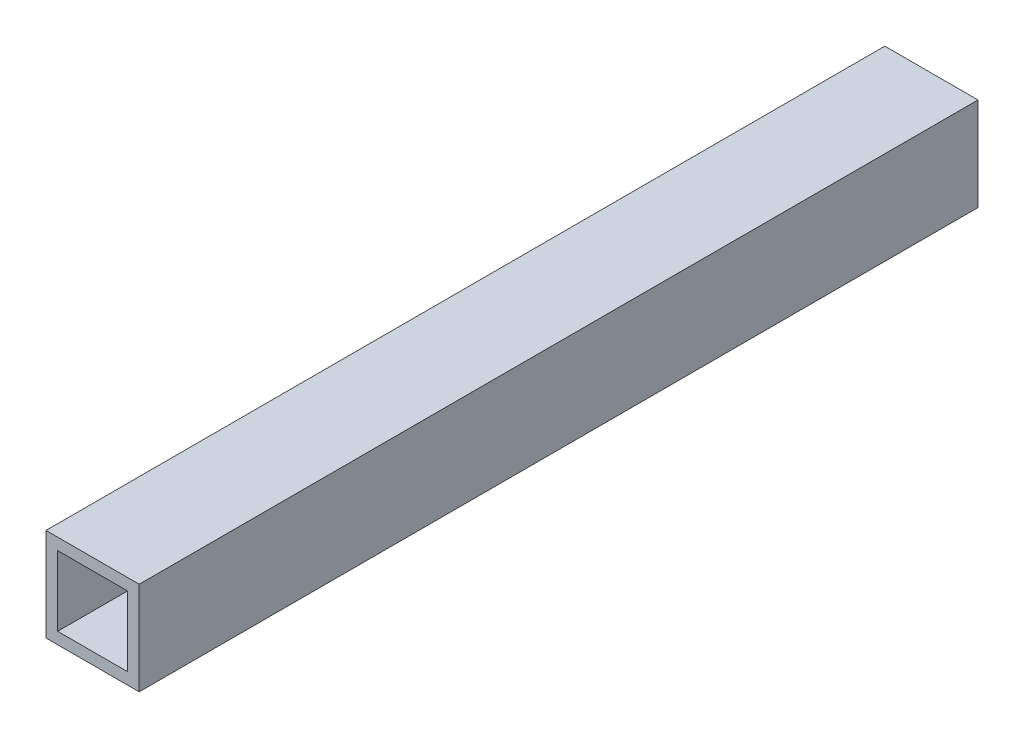
ISO-10303-21;
HEADER;
FILE_DESCRIPTION(('STEP AP214'),'2;1');
FILE_NAME('part.step','',(''),(''),'','','');
FILE_SCHEMA(('AUTOMOTIVE_DESIGN { 1 0 10303 214 1 1 1 1 }'));
ENDSEC;
DATA;
#1=APPLICATION_CONTEXT('core data for automotive mechanical design processes');
#2=APPLICATION_PROTOCOL_DEFINITION('international standard','automotive_design',2000,#1);
#3=PRODUCT_CONTEXT('',#1,'mechanical');
#4=PRODUCT('Part','Part','',(#3));
#5=PRODUCT_RELATED_PRODUCT_CATEGORY('part','',(#4));
#6=PRODUCT_DEFINITION_FORMATION('','',#4);
#7=PRODUCT_DEFINITION_CONTEXT('part definition',#1,'design');
#8=PRODUCT_DEFINITION('design','',#6,#7);
#9=PRODUCT_DEFINITION_SHAPE('','',#8);
#10=(LENGTH_UNIT() NAMED_UNIT(*) SI_UNIT(.MILLI.,.METRE.));
#11=(NAMED_UNIT(*) PLANE_ANGLE_UNIT() SI_UNIT($,.RADIAN.));
#12=(NAMED_UNIT(*) SI_UNIT($,.STERADIAN.) SOLID_ANGLE_UNIT());
#13=UNCERTAINTY_MEASURE_WITH_UNIT(LENGTH_MEASURE(1.E-05),#10,'distance_accuracy_value','');
#14=(GEOMETRIC_REPRESENTATION_CONTEXT(3) GLOBAL_UNCERTAINTY_ASSIGNED_CONTEXT((#13)) GLOBAL_UNIT_ASSIGNED_CONTEXT((#10,
#11,#12)) REPRESENTATION_CONTEXT('',''));
#15=CARTESIAN_POINT('',(0.,0.,0.));
#16=DIRECTION('',(0.,0.,1.));
#17=DIRECTION('',(1.,0.,0.));
#18=AXIS2_PLACEMENT_3D('',#15,#16,#17);
#19=CARTESIAN_POINT('',(0.,0.,114.3));
#20=DIRECTION('',(0.,0.,1.));
#21=DIRECTION('',(1.,0.,0.));
#22=AXIS2_PLACEMENT_3D('',#19,#20,#21);
#23=PLANE('',#22);
#24=DIRECTION('',(0.,-1.,0.));
#25=VECTOR('',#24,1.);
#26=CARTESIAN_POINT('',(-12.7,-12.7,114.3));
#27=LINE('',#26,#25);
#28=CARTESIAN_POINT('',(-12.7,12.7,114.3));
#29=VERTEX_POINT('',#28);
#30=CARTESIAN_POINT('',(-12.7,-12.7,114.3));
#31=VERTEX_POINT('',#30);
#32=EDGE_CURVE('E117',#29,#31,#27,.T.);
#33=ORIENTED_EDGE('',*,*,#32,.T.);
#34=DIRECTION('',(1.,0.,0.));
#35=VECTOR('',#34,1.);
#36=CARTESIAN_POINT('',(12.7,-12.7,114.3));
#37=LINE('',#36,#35);
#38=CARTESIAN_POINT('',(12.7,-12.7,114.3));
#39=VERTEX_POINT('',#38);
#40=EDGE_CURVE('E176',#31,#39,#37,.T.);
#41=ORIENTED_EDGE('',*,*,#40,.T.);
#42=DIRECTION('',(0.,1.,0.));
#43=VECTOR('',#42,1.);
#44=CARTESIAN_POINT('',(12.7,-12.7,114.3));
#45=LINE('',#44,#43);
#46=CARTESIAN_POINT('',(12.7,12.7,114.3));
#47=VERTEX_POINT('',#46);
#48=EDGE_CURVE('E179',#39,#47,#45,.T.);
#49=ORIENTED_EDGE('',*,*,#48,.T.);
#50=DIRECTION('',(-1.,0.,0.));
#51=VECTOR('',#50,1.);
#52=CARTESIAN_POINT('',(12.7,12.7,114.3));
#53=LINE('',#52,#51);
#54=EDGE_CURVE('E63',#47,#29,#53,.T.);
#55=ORIENTED_EDGE('',*,*,#54,.T.);
#56=EDGE_LOOP('',(#33,#41,#49,#55));
#57=FACE_BOUND('',#56,.T.);
#58=DIRECTION('',(1.,0.,0.));
#59=VECTOR('',#58,1.);
#60=CARTESIAN_POINT('',(9.525,-9.525,114.3));
#61=LINE('',#60,#59);
#62=CARTESIAN_POINT('',(-9.52499999999999,-9.525,114.3));
#63=VERTEX_POINT('',#62);
#64=CARTESIAN_POINT('',(9.525,-9.525,114.3));
#65=VERTEX_POINT('',#64);
#66=EDGE_CURVE('E158',#63,#65,#61,.T.);
#67=ORIENTED_EDGE('',*,*,#66,.F.);
#68=DIRECTION('',(0.,-1.,0.));
#69=VECTOR('',#68,1.);
#70=CARTESIAN_POINT('',(-9.52499999999999,-9.525,114.3));
#71=LINE('',#70,#69);
#72=CARTESIAN_POINT('',(-9.52499999999999,9.525,114.3));
#73=VERTEX_POINT('',#72);
#74=EDGE_CURVE('E113',#73,#63,#71,.T.);
#75=ORIENTED_EDGE('',*,*,#74,.F.);
#76=DIRECTION('',(-1.,0.,0.));
#77=VECTOR('',#76,1.);
#78=CARTESIAN_POINT('',(9.525,9.525,114.3));
#79=LINE('',#78,#77);
#80=CARTESIAN_POINT('',(9.525,9.525,114.3));
#81=VERTEX_POINT('',#80);
#82=EDGE_CURVE('E164',#81,#73,#79,.T.);
#83=ORIENTED_EDGE('',*,*,#82,.F.);
#84=DIRECTION('',(0.,1.,0.));
#85=VECTOR('',#84,1.);
#86=CARTESIAN_POINT('',(9.525,-9.525,114.3));
#87=LINE('',#86,#85);
#88=EDGE_CURVE('E161',#65,#81,#87,.T.);
#89=ORIENTED_EDGE('',*,*,#88,.F.);
#90=EDGE_LOOP('',(#67,#75,#83,#89));
#91=FACE_BOUND('',#90,.T.);
#92=ADVANCED_FACE('F39',(#57,#91),#23,.T.);
#93=CARTESIAN_POINT('',(-12.7,-12.7,114.3));
#94=DIRECTION('',(1.,0.,0.));
#95=DIRECTION('',(0.,0.,-1.));
#96=AXIS2_PLACEMENT_3D('',#93,#94,#95);
#97=PLANE('',#96);
#98=DIRECTION('',(0.,0.,-1.));
#99=VECTOR('',#98,1.);
#100=CARTESIAN_POINT('',(-12.7,12.7,114.3));
#101=LINE('',#100,#99);
#102=CARTESIAN_POINT('',(-12.7,12.7,-114.3));
#103=VERTEX_POINT('',#102);
#104=EDGE_CURVE('E184',#29,#103,#101,.T.);
#105=ORIENTED_EDGE('',*,*,#104,.T.);
#106=DIRECTION('',(0.,-1.,0.));
#107=VECTOR('',#106,1.);
#108=CARTESIAN_POINT('',(-12.7,-12.7,-114.3));
#109=LINE('',#108,#107);
#110=CARTESIAN_POINT('',(-12.7,-12.7,-114.3));
#111=VERTEX_POINT('',#110);
#112=EDGE_CURVE('E140',#103,#111,#109,.T.);
#113=ORIENTED_EDGE('',*,*,#112,.T.);
#114=DIRECTION('',(0.,0.,-1.));
#115=VECTOR('',#114,1.);
#116=CARTESIAN_POINT('',(-12.7,-12.7,114.3));
#117=LINE('',#116,#115);
#118=EDGE_CURVE('E11',#31,#111,#117,.T.);
#119=ORIENTED_EDGE('',*,*,#118,.F.);
#120=ORIENTED_EDGE('',*,*,#32,.F.);
#121=EDGE_LOOP('',(#105,#113,#119,#120));
#122=FACE_BOUND('',#121,.T.);
#123=ADVANCED_FACE('F41',(#122),#97,.F.);
#124=CARTESIAN_POINT('',(12.7,-12.7,114.3));
#125=DIRECTION('',(0.,1.,0.));
#126=DIRECTION('',(0.,0.,1.));
#127=AXIS2_PLACEMENT_3D('',#124,#125,#126);
#128=PLANE('',#127);
#129=ORIENTED_EDGE('',*,*,#118,.T.);
#130=DIRECTION('',(1.,0.,0.));
#131=VECTOR('',#130,1.);
#132=CARTESIAN_POINT('',(12.7,-12.7,-114.3));
#133=LINE('',#132,#131);
#134=CARTESIAN_POINT('',(12.7,-12.7,-114.3));
#135=VERTEX_POINT('',#134);
#136=EDGE_CURVE('E144',#111,#135,#133,.T.);
#137=ORIENTED_EDGE('',*,*,#136,.T.);
#138=DIRECTION('',(0.,0.,-1.));
#139=VECTOR('',#138,1.);
#140=CARTESIAN_POINT('',(12.7,-12.7,114.3));
#141=LINE('',#140,#139);
#142=EDGE_CURVE('E48',#39,#135,#141,.T.);
#143=ORIENTED_EDGE('',*,*,#142,.F.);
#144=ORIENTED_EDGE('',*,*,#40,.F.);
#145=EDGE_LOOP('',(#129,#137,#143,#144));
#146=FACE_BOUND('',#145,.T.);
#147=ADVANCED_FACE('F200',(#146),#128,.F.);
#148=CARTESIAN_POINT('',(12.7,-12.7,114.3));
#149=DIRECTION('',(-1.,0.,0.));
#150=DIRECTION('',(0.,0.,1.));
#151=AXIS2_PLACEMENT_3D('',#148,#149,#150);
#152=PLANE('',#151);
#153=ORIENTED_EDGE('',*,*,#142,.T.);
#154=DIRECTION('',(0.,1.,0.));
#155=VECTOR('',#154,1.);
#156=CARTESIAN_POINT('',(12.7,-12.7,-114.3));
#157=LINE('',#156,#155);
#158=CARTESIAN_POINT('',(12.7,12.7,-114.3));
#159=VERTEX_POINT('',#158);
#160=EDGE_CURVE('E148',#135,#159,#157,.T.);
#161=ORIENTED_EDGE('',*,*,#160,.T.);
#162=DIRECTION('',(0.,0.,-1.));
#163=VECTOR('',#162,1.);
#164=CARTESIAN_POINT('',(12.7,12.7,114.3));
#165=LINE('',#164,#163);
#166=EDGE_CURVE('E187',#47,#159,#165,.T.);
#167=ORIENTED_EDGE('',*,*,#166,.F.);
#168=ORIENTED_EDGE('',*,*,#48,.F.);
#169=EDGE_LOOP('',(#153,#161,#167,#168));
#170=FACE_BOUND('',#169,.T.);
#171=ADVANCED_FACE('F194',(#170),#152,.F.);
#172=CARTESIAN_POINT('',(12.7,12.7,114.3));
#173=DIRECTION('',(0.,-1.,0.));
#174=DIRECTION('',(0.,0.,-1.));
#175=AXIS2_PLACEMENT_3D('',#172,#173,#174);
#176=PLANE('',#175);
#177=ORIENTED_EDGE('',*,*,#166,.T.);
#178=DIRECTION('',(-1.,0.,0.));
#179=VECTOR('',#178,1.);
#180=CARTESIAN_POINT('',(12.7,12.7,-114.3));
#181=LINE('',#180,#179);
#182=EDGE_CURVE('E152',#159,#103,#181,.T.);
#183=ORIENTED_EDGE('',*,*,#182,.T.);
#184=ORIENTED_EDGE('',*,*,#104,.F.);
#185=ORIENTED_EDGE('',*,*,#54,.F.);
#186=EDGE_LOOP('',(#177,#183,#184,#185));
#187=FACE_BOUND('',#186,.T.);
#188=ADVANCED_FACE('F205',(#187),#176,.F.);
#189=CARTESIAN_POINT('',(-9.52499999999999,-9.525,114.3));
#190=DIRECTION('',(1.,0.,0.));
#191=DIRECTION('',(0.,0.,-1.));
#192=AXIS2_PLACEMENT_3D('',#189,#190,#191);
#193=PLANE('',#192);
#194=DIRECTION('',(0.,0.,-1.));
#195=VECTOR('',#194,1.);
#196=CARTESIAN_POINT('',(-9.52499999999999,-9.525,114.3));
#197=LINE('',#196,#195);
#198=CARTESIAN_POINT('',(-9.52499999999999,-9.525,-114.3));
#199=VERTEX_POINT('',#198);
#200=EDGE_CURVE('E105',#63,#199,#197,.T.);
#201=ORIENTED_EDGE('',*,*,#200,.T.);
#202=DIRECTION('',(0.,-1.,0.));
#203=VECTOR('',#202,1.);
#204=CARTESIAN_POINT('',(-9.52499999999999,-9.525,-114.3));
#205=LINE('',#204,#203);
#206=CARTESIAN_POINT('',(-9.52499999999999,9.525,-114.3));
#207=VERTEX_POINT('',#206);
#208=EDGE_CURVE('E110',#207,#199,#205,.T.);
#209=ORIENTED_EDGE('',*,*,#208,.F.);
#210=DIRECTION('',(0.,0.,-1.));
#211=VECTOR('',#210,1.);
#212=CARTESIAN_POINT('',(-9.52499999999999,9.525,114.3));
#213=LINE('',#212,#211);
#214=EDGE_CURVE('E167',#73,#207,#213,.T.);
#215=ORIENTED_EDGE('',*,*,#214,.F.);
#216=ORIENTED_EDGE('',*,*,#74,.T.);
#217=EDGE_LOOP('',(#201,#209,#215,#216));
#218=FACE_BOUND('',#217,.T.);
#219=ADVANCED_FACE('F107',(#218),#193,.T.);
#220=CARTESIAN_POINT('',(9.525,-9.525,114.3));
#221=DIRECTION('',(0.,1.,0.));
#222=DIRECTION('',(0.,0.,1.));
#223=AXIS2_PLACEMENT_3D('',#220,#221,#222);
#224=PLANE('',#223);
#225=DIRECTION('',(0.,0.,-1.));
#226=VECTOR('',#225,1.);
#227=CARTESIAN_POINT('',(9.525,-9.525,114.3));
#228=LINE('',#227,#226);
#229=CARTESIAN_POINT('',(9.525,-9.525,-114.3));
#230=VERTEX_POINT('',#229);
#231=EDGE_CURVE('E118',#65,#230,#228,.T.);
#232=ORIENTED_EDGE('',*,*,#231,.T.);
#233=DIRECTION('',(1.,0.,0.));
#234=VECTOR('',#233,1.);
#235=CARTESIAN_POINT('',(9.525,-9.525,-114.3));
#236=LINE('',#235,#234);
#237=EDGE_CURVE('E121',#199,#230,#236,.T.);
#238=ORIENTED_EDGE('',*,*,#237,.F.);
#239=ORIENTED_EDGE('',*,*,#200,.F.);
#240=ORIENTED_EDGE('',*,*,#66,.T.);
#241=EDGE_LOOP('',(#232,#238,#239,#240));
#242=FACE_BOUND('',#241,.T.);
#243=ADVANCED_FACE('F122',(#242),#224,.T.);
#244=CARTESIAN_POINT('',(9.525,-9.525,114.3));
#245=DIRECTION('',(-1.,0.,0.));
#246=DIRECTION('',(0.,0.,1.));
#247=AXIS2_PLACEMENT_3D('',#244,#245,#246);
#248=PLANE('',#247);
#249=DIRECTION('',(0.,0.,-1.));
#250=VECTOR('',#249,1.);
#251=CARTESIAN_POINT('',(9.525,9.525,114.3));
#252=LINE('',#251,#250);
#253=CARTESIAN_POINT('',(9.525,9.525,-114.3));
#254=VERTEX_POINT('',#253);
#255=EDGE_CURVE('E55',#81,#254,#252,.T.);
#256=ORIENTED_EDGE('',*,*,#255,.T.);
#257=DIRECTION('',(0.,1.,0.));
#258=VECTOR('',#257,1.);
#259=CARTESIAN_POINT('',(9.525,-9.525,-114.3));
#260=LINE('',#259,#258);
#261=EDGE_CURVE('E128',#230,#254,#260,.T.);
#262=ORIENTED_EDGE('',*,*,#261,.F.);
#263=ORIENTED_EDGE('',*,*,#231,.F.);
#264=ORIENTED_EDGE('',*,*,#88,.T.);
#265=EDGE_LOOP('',(#256,#262,#263,#264));
#266=FACE_BOUND('',#265,.T.);
#267=ADVANCED_FACE('F223',(#266),#248,.T.);
#268=CARTESIAN_POINT('',(9.525,9.525,114.3));
#269=DIRECTION('',(0.,-1.,0.));
#270=DIRECTION('',(0.,0.,-1.));
#271=AXIS2_PLACEMENT_3D('',#268,#269,#270);
#272=PLANE('',#271);
#273=ORIENTED_EDGE('',*,*,#214,.T.);
#274=DIRECTION('',(-1.,0.,0.));
#275=VECTOR('',#274,1.);
#276=CARTESIAN_POINT('',(9.525,9.525,-114.3));
#277=LINE('',#276,#275);
#278=EDGE_CURVE('E132',#254,#207,#277,.T.);
#279=ORIENTED_EDGE('',*,*,#278,.F.);
#280=ORIENTED_EDGE('',*,*,#255,.F.);
#281=ORIENTED_EDGE('',*,*,#82,.T.);
#282=EDGE_LOOP('',(#273,#279,#280,#281));
#283=FACE_BOUND('',#282,.T.);
#284=ADVANCED_FACE('F226',(#283),#272,.T.);
#285=CARTESIAN_POINT('',(0.,0.,-114.3));
#286=DIRECTION('',(0.,0.,1.));
#287=DIRECTION('',(1.,0.,0.));
#288=AXIS2_PLACEMENT_3D('',#285,#286,#287);
#289=PLANE('',#288);
#290=ORIENTED_EDGE('',*,*,#278,.T.);
#291=ORIENTED_EDGE('',*,*,#208,.T.);
#292=ORIENTED_EDGE('',*,*,#237,.T.);
#293=ORIENTED_EDGE('',*,*,#261,.T.);
#294=EDGE_LOOP('',(#290,#291,#292,#293));
#295=FACE_BOUND('',#294,.T.);
#296=ORIENTED_EDGE('',*,*,#112,.F.);
#297=ORIENTED_EDGE('',*,*,#182,.F.);
#298=ORIENTED_EDGE('',*,*,#160,.F.);
#299=ORIENTED_EDGE('',*,*,#136,.F.);
#300=EDGE_LOOP('',(#296,#297,#298,#299));
#301=FACE_BOUND('',#300,.T.);
#302=ADVANCED_FACE('F130',(#295,#301),#289,.F.);
#303=CLOSED_SHELL('',(#92,#123,#147,#171,#188,#219,#243,#267,#284,#302));
#304=MANIFOLD_SOLID_BREP('B2',#303);
#305=ADVANCED_BREP_SHAPE_REPRESENTATION('',(#18,#304),#14);
#306=SHAPE_DEFINITION_REPRESENTATION(#9,#305);
ENDSEC;
END-ISO-10303-21;
